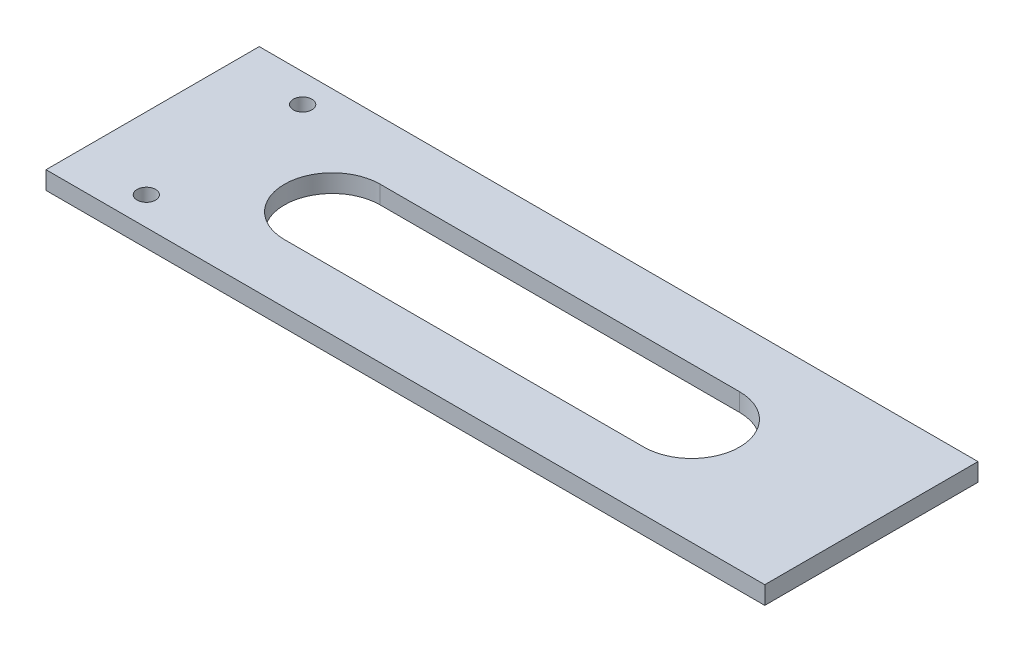
ISO-10303-21;
HEADER;
FILE_DESCRIPTION(('STEP AP214'),'2;1');
FILE_NAME('part.step','',(''),(''),'','','');
FILE_SCHEMA(('AUTOMOTIVE_DESIGN { 1 0 10303 214 1 1 1 1 }'));
ENDSEC;
DATA;
#1=APPLICATION_CONTEXT('core data for automotive mechanical design processes');
#2=APPLICATION_PROTOCOL_DEFINITION('international standard','automotive_design',2000,#1);
#3=PRODUCT_CONTEXT('',#1,'mechanical');
#4=PRODUCT('Part','Part','',(#3));
#5=PRODUCT_RELATED_PRODUCT_CATEGORY('part','',(#4));
#6=PRODUCT_DEFINITION_FORMATION('','',#4);
#7=PRODUCT_DEFINITION_CONTEXT('part definition',#1,'design');
#8=PRODUCT_DEFINITION('design','',#6,#7);
#9=PRODUCT_DEFINITION_SHAPE('','',#8);
#10=(LENGTH_UNIT() NAMED_UNIT(*) SI_UNIT(.MILLI.,.METRE.));
#11=(NAMED_UNIT(*) PLANE_ANGLE_UNIT() SI_UNIT($,.RADIAN.));
#12=(NAMED_UNIT(*) SI_UNIT($,.STERADIAN.) SOLID_ANGLE_UNIT());
#13=UNCERTAINTY_MEASURE_WITH_UNIT(LENGTH_MEASURE(1.E-05),#10,'distance_accuracy_value','');
#14=(GEOMETRIC_REPRESENTATION_CONTEXT(3) GLOBAL_UNCERTAINTY_ASSIGNED_CONTEXT((#13)) GLOBAL_UNIT_ASSIGNED_CONTEXT((#10,
#11,#12)) REPRESENTATION_CONTEXT('',''));
#15=CARTESIAN_POINT('',(0.,0.,0.));
#16=DIRECTION('',(0.,0.,1.));
#17=DIRECTION('',(1.,0.,0.));
#18=AXIS2_PLACEMENT_3D('',#15,#16,#17);
#19=CARTESIAN_POINT('',(0.,3.,0.));
#20=DIRECTION('',(0.,-1.,0.));
#21=DIRECTION('',(0.,0.,-1.));
#22=AXIS2_PLACEMENT_3D('',#19,#20,#21);
#23=PLANE('',#22);
#24=CARTESIAN_POINT('',(11.9999999999996,3.,-4.75000000000009));
#25=DIRECTION('',(0.,-1.,0.));
#26=DIRECTION('',(0.,0.,-1.));
#27=AXIS2_PLACEMENT_3D('',#24,#25,#26);
#28=CIRCLE('',#27,1.55);
#29=CARTESIAN_POINT('',(11.9999999999996,3.,-6.30000000000009));
#30=VERTEX_POINT('',#29);
#31=EDGE_CURVE('E234',#30,#30,#28,.T.);
#32=ORIENTED_EDGE('',*,*,#31,.T.);
#33=EDGE_LOOP('',(#32));
#34=FACE_BOUND('',#33,.T.);
#35=CARTESIAN_POINT('',(11.9999999999996,3.,-30.8500000000001));
#36=DIRECTION('',(0.,-1.,0.));
#37=DIRECTION('',(0.,0.,-1.));
#38=AXIS2_PLACEMENT_3D('',#35,#36,#37);
#39=CIRCLE('',#38,1.55);
#40=CARTESIAN_POINT('',(11.9999999999996,3.,-32.4000000000001));
#41=VERTEX_POINT('',#40);
#42=EDGE_CURVE('E128',#41,#41,#39,.T.);
#43=ORIENTED_EDGE('',*,*,#42,.T.);
#44=EDGE_LOOP('',(#43));
#45=FACE_BOUND('',#44,.T.);
#46=DIRECTION('',(0.,0.,1.));
#47=VECTOR('',#46,1.);
#48=CARTESIAN_POINT('',(0.,3.,0.));
#49=LINE('',#48,#47);
#50=CARTESIAN_POINT('',(0.,3.,-35.6));
#51=VERTEX_POINT('',#50);
#52=CARTESIAN_POINT('',(0.,3.,0.));
#53=VERTEX_POINT('',#52);
#54=EDGE_CURVE('E138',#51,#53,#49,.T.);
#55=ORIENTED_EDGE('',*,*,#54,.T.);
#56=DIRECTION('',(1.,0.,0.));
#57=VECTOR('',#56,1.);
#58=CARTESIAN_POINT('',(0.,3.,0.));
#59=LINE('',#58,#57);
#60=CARTESIAN_POINT('',(120.,3.,0.));
#61=VERTEX_POINT('',#60);
#62=EDGE_CURVE('E141',#53,#61,#59,.T.);
#63=ORIENTED_EDGE('',*,*,#62,.T.);
#64=DIRECTION('',(0.,0.,-1.));
#65=VECTOR('',#64,1.);
#66=CARTESIAN_POINT('',(120.,3.,0.));
#67=LINE('',#66,#65);
#68=CARTESIAN_POINT('',(120.,3.,-35.6));
#69=VERTEX_POINT('',#68);
#70=EDGE_CURVE('E144',#61,#69,#67,.T.);
#71=ORIENTED_EDGE('',*,*,#70,.T.);
#72=DIRECTION('',(-1.,0.,0.));
#73=VECTOR('',#72,1.);
#74=CARTESIAN_POINT('',(0.,3.,-35.6));
#75=LINE('',#74,#73);
#76=EDGE_CURVE('E146',#69,#51,#75,.T.);
#77=ORIENTED_EDGE('',*,*,#76,.T.);
#78=EDGE_LOOP('',(#55,#63,#71,#77));
#79=FACE_BOUND('',#78,.T.);
#80=CARTESIAN_POINT('',(30.,3.,-17.8));
#81=DIRECTION('',(0.,1.,0.));
#82=DIRECTION('',(0.,0.,1.));
#83=AXIS2_PLACEMENT_3D('',#80,#81,#82);
#84=CIRCLE('',#83,8.00000000000001);
#85=CARTESIAN_POINT('',(30.,3.,-25.8));
#86=VERTEX_POINT('',#85);
#87=CARTESIAN_POINT('',(30.,3.,-9.79999999999999));
#88=VERTEX_POINT('',#87);
#89=EDGE_CURVE('E100',#86,#88,#84,.T.);
#90=ORIENTED_EDGE('',*,*,#89,.F.);
#91=DIRECTION('',(-1.,0.,0.));
#92=VECTOR('',#91,1.);
#93=CARTESIAN_POINT('',(30.,3.,-25.8));
#94=LINE('',#93,#92);
#95=CARTESIAN_POINT('',(90.,3.,-25.8));
#96=VERTEX_POINT('',#95);
#97=EDGE_CURVE('E122',#96,#86,#94,.T.);
#98=ORIENTED_EDGE('',*,*,#97,.F.);
#99=CARTESIAN_POINT('',(90.,3.,-17.8));
#100=DIRECTION('',(0.,1.,0.));
#101=DIRECTION('',(0.,0.,1.));
#102=AXIS2_PLACEMENT_3D('',#99,#100,#101);
#103=CIRCLE('',#102,8.00000000000001);
#104=CARTESIAN_POINT('',(90.,3.,-9.8));
#105=VERTEX_POINT('',#104);
#106=EDGE_CURVE('E120',#105,#96,#103,.T.);
#107=ORIENTED_EDGE('',*,*,#106,.F.);
#108=DIRECTION('',(1.,0.,0.));
#109=VECTOR('',#108,1.);
#110=CARTESIAN_POINT('',(30.,3.,-9.79999999999999));
#111=LINE('',#110,#109);
#112=EDGE_CURVE('E108',#88,#105,#111,.T.);
#113=ORIENTED_EDGE('',*,*,#112,.F.);
#114=EDGE_LOOP('',(#90,#98,#107,#113));
#115=FACE_BOUND('',#114,.T.);
#116=ADVANCED_FACE('F35',(#34,#45,#79,#115),#23,.F.);
#117=CARTESIAN_POINT('',(0.,0.,0.));
#118=DIRECTION('',(0.,-1.,0.));
#119=DIRECTION('',(0.,0.,-1.));
#120=AXIS2_PLACEMENT_3D('',#117,#118,#119);
#121=PLANE('',#120);
#122=CARTESIAN_POINT('',(11.9999999999996,0.,-4.75000000000009));
#123=DIRECTION('',(0.,-1.,0.));
#124=DIRECTION('',(0.,0.,-1.));
#125=AXIS2_PLACEMENT_3D('',#122,#123,#124);
#126=CIRCLE('',#125,1.55);
#127=CARTESIAN_POINT('',(11.9999999999996,0.,-6.30000000000009));
#128=VERTEX_POINT('',#127);
#129=EDGE_CURVE('E237',#128,#128,#126,.T.);
#130=ORIENTED_EDGE('',*,*,#129,.F.);
#131=EDGE_LOOP('',(#130));
#132=FACE_BOUND('',#131,.T.);
#133=CARTESIAN_POINT('',(11.9999999999996,0.,-30.8500000000001));
#134=DIRECTION('',(0.,-1.,0.));
#135=DIRECTION('',(0.,0.,-1.));
#136=AXIS2_PLACEMENT_3D('',#133,#134,#135);
#137=CIRCLE('',#136,1.55);
#138=CARTESIAN_POINT('',(11.9999999999996,0.,-32.4000000000001));
#139=VERTEX_POINT('',#138);
#140=EDGE_CURVE('E232',#139,#139,#137,.T.);
#141=ORIENTED_EDGE('',*,*,#140,.F.);
#142=EDGE_LOOP('',(#141));
#143=FACE_BOUND('',#142,.T.);
#144=DIRECTION('',(0.,0.,1.));
#145=VECTOR('',#144,1.);
#146=CARTESIAN_POINT('',(0.,0.,0.));
#147=LINE('',#146,#145);
#148=CARTESIAN_POINT('',(0.,0.,-35.6));
#149=VERTEX_POINT('',#148);
#150=CARTESIAN_POINT('',(0.,0.,0.));
#151=VERTEX_POINT('',#150);
#152=EDGE_CURVE('E116',#149,#151,#147,.T.);
#153=ORIENTED_EDGE('',*,*,#152,.F.);
#154=DIRECTION('',(-1.,0.,0.));
#155=VECTOR('',#154,1.);
#156=CARTESIAN_POINT('',(0.,0.,-35.6));
#157=LINE('',#156,#155);
#158=CARTESIAN_POINT('',(120.,0.,-35.6));
#159=VERTEX_POINT('',#158);
#160=EDGE_CURVE('E142',#159,#149,#157,.T.);
#161=ORIENTED_EDGE('',*,*,#160,.F.);
#162=DIRECTION('',(0.,0.,-1.));
#163=VECTOR('',#162,1.);
#164=CARTESIAN_POINT('',(120.,0.,0.));
#165=LINE('',#164,#163);
#166=CARTESIAN_POINT('',(120.,0.,0.));
#167=VERTEX_POINT('',#166);
#168=EDGE_CURVE('E153',#167,#159,#165,.T.);
#169=ORIENTED_EDGE('',*,*,#168,.F.);
#170=DIRECTION('',(1.,0.,0.));
#171=VECTOR('',#170,1.);
#172=CARTESIAN_POINT('',(0.,0.,0.));
#173=LINE('',#172,#171);
#174=EDGE_CURVE('E151',#151,#167,#173,.T.);
#175=ORIENTED_EDGE('',*,*,#174,.F.);
#176=EDGE_LOOP('',(#153,#161,#169,#175));
#177=FACE_BOUND('',#176,.T.);
#178=DIRECTION('',(-1.,0.,0.));
#179=VECTOR('',#178,1.);
#180=CARTESIAN_POINT('',(30.,0.,-25.8));
#181=LINE('',#180,#179);
#182=CARTESIAN_POINT('',(90.,0.,-25.8));
#183=VERTEX_POINT('',#182);
#184=CARTESIAN_POINT('',(30.,0.,-25.8));
#185=VERTEX_POINT('',#184);
#186=EDGE_CURVE('E109',#183,#185,#181,.T.);
#187=ORIENTED_EDGE('',*,*,#186,.T.);
#188=CARTESIAN_POINT('',(30.,0.,-17.8));
#189=DIRECTION('',(0.,1.,0.));
#190=DIRECTION('',(0.,0.,1.));
#191=AXIS2_PLACEMENT_3D('',#188,#189,#190);
#192=CIRCLE('',#191,8.00000000000001);
#193=CARTESIAN_POINT('',(30.,0.,-9.79999999999999));
#194=VERTEX_POINT('',#193);
#195=EDGE_CURVE('E58',#185,#194,#192,.T.);
#196=ORIENTED_EDGE('',*,*,#195,.T.);
#197=DIRECTION('',(1.,0.,0.));
#198=VECTOR('',#197,1.);
#199=CARTESIAN_POINT('',(30.,0.,-9.79999999999999));
#200=LINE('',#199,#198);
#201=CARTESIAN_POINT('',(90.,0.,-9.8));
#202=VERTEX_POINT('',#201);
#203=EDGE_CURVE('E115',#194,#202,#200,.T.);
#204=ORIENTED_EDGE('',*,*,#203,.T.);
#205=CARTESIAN_POINT('',(90.,0.,-17.8));
#206=DIRECTION('',(0.,1.,0.));
#207=DIRECTION('',(0.,0.,1.));
#208=AXIS2_PLACEMENT_3D('',#205,#206,#207);
#209=CIRCLE('',#208,8.00000000000001);
#210=EDGE_CURVE('E130',#202,#183,#209,.T.);
#211=ORIENTED_EDGE('',*,*,#210,.T.);
#212=EDGE_LOOP('',(#187,#196,#204,#211));
#213=FACE_BOUND('',#212,.T.);
#214=ADVANCED_FACE('F171',(#132,#143,#177,#213),#121,.T.);
#215=CARTESIAN_POINT('',(0.,3.,0.));
#216=DIRECTION('',(1.,0.,0.));
#217=DIRECTION('',(0.,0.,-1.));
#218=AXIS2_PLACEMENT_3D('',#215,#216,#217);
#219=PLANE('',#218);
#220=ORIENTED_EDGE('',*,*,#152,.T.);
#221=DIRECTION('',(0.,-1.,0.));
#222=VECTOR('',#221,1.);
#223=CARTESIAN_POINT('',(0.,3.,0.));
#224=LINE('',#223,#222);
#225=EDGE_CURVE('E11',#53,#151,#224,.T.);
#226=ORIENTED_EDGE('',*,*,#225,.F.);
#227=ORIENTED_EDGE('',*,*,#54,.F.);
#228=DIRECTION('',(0.,-1.,0.));
#229=VECTOR('',#228,1.);
#230=CARTESIAN_POINT('',(0.,3.,-35.6));
#231=LINE('',#230,#229);
#232=EDGE_CURVE('E148',#51,#149,#231,.T.);
#233=ORIENTED_EDGE('',*,*,#232,.T.);
#234=EDGE_LOOP('',(#220,#226,#227,#233));
#235=FACE_BOUND('',#234,.T.);
#236=ADVANCED_FACE('F37',(#235),#219,.F.);
#237=CARTESIAN_POINT('',(0.,3.,0.));
#238=DIRECTION('',(0.,0.,-1.));
#239=DIRECTION('',(-1.,0.,0.));
#240=AXIS2_PLACEMENT_3D('',#237,#238,#239);
#241=PLANE('',#240);
#242=ORIENTED_EDGE('',*,*,#174,.T.);
#243=DIRECTION('',(0.,-1.,0.));
#244=VECTOR('',#243,1.);
#245=CARTESIAN_POINT('',(120.,3.,0.));
#246=LINE('',#245,#244);
#247=EDGE_CURVE('E43',#61,#167,#246,.T.);
#248=ORIENTED_EDGE('',*,*,#247,.F.);
#249=ORIENTED_EDGE('',*,*,#62,.F.);
#250=ORIENTED_EDGE('',*,*,#225,.T.);
#251=EDGE_LOOP('',(#242,#248,#249,#250));
#252=FACE_BOUND('',#251,.T.);
#253=ADVANCED_FACE('F181',(#252),#241,.F.);
#254=CARTESIAN_POINT('',(120.,3.,0.));
#255=DIRECTION('',(-1.,0.,0.));
#256=DIRECTION('',(0.,0.,1.));
#257=AXIS2_PLACEMENT_3D('',#254,#255,#256);
#258=PLANE('',#257);
#259=ORIENTED_EDGE('',*,*,#168,.T.);
#260=DIRECTION('',(0.,-1.,0.));
#261=VECTOR('',#260,1.);
#262=CARTESIAN_POINT('',(120.,3.,-35.6));
#263=LINE('',#262,#261);
#264=EDGE_CURVE('E158',#69,#159,#263,.T.);
#265=ORIENTED_EDGE('',*,*,#264,.F.);
#266=ORIENTED_EDGE('',*,*,#70,.F.);
#267=ORIENTED_EDGE('',*,*,#247,.T.);
#268=EDGE_LOOP('',(#259,#265,#266,#267));
#269=FACE_BOUND('',#268,.T.);
#270=ADVANCED_FACE('F165',(#269),#258,.F.);
#271=CARTESIAN_POINT('',(0.,3.,-35.6));
#272=DIRECTION('',(0.,0.,1.));
#273=DIRECTION('',(1.,0.,0.));
#274=AXIS2_PLACEMENT_3D('',#271,#272,#273);
#275=PLANE('',#274);
#276=ORIENTED_EDGE('',*,*,#160,.T.);
#277=ORIENTED_EDGE('',*,*,#232,.F.);
#278=ORIENTED_EDGE('',*,*,#76,.F.);
#279=ORIENTED_EDGE('',*,*,#264,.T.);
#280=EDGE_LOOP('',(#276,#277,#278,#279));
#281=FACE_BOUND('',#280,.T.);
#282=ADVANCED_FACE('F175',(#281),#275,.F.);
#283=CARTESIAN_POINT('',(30.,3.,-17.8));
#284=DIRECTION('',(0.,-1.,0.));
#285=DIRECTION('',(0.,0.,-1.));
#286=AXIS2_PLACEMENT_3D('',#283,#284,#285);
#287=CYLINDRICAL_SURFACE('',#286,8.00000000000001);
#288=ORIENTED_EDGE('',*,*,#195,.F.);
#289=DIRECTION('',(0.,-1.,0.));
#290=VECTOR('',#289,1.);
#291=CARTESIAN_POINT('',(30.,3.,-25.8));
#292=LINE('',#291,#290);
#293=EDGE_CURVE('E104',#86,#185,#292,.T.);
#294=ORIENTED_EDGE('',*,*,#293,.F.);
#295=ORIENTED_EDGE('',*,*,#89,.T.);
#296=DIRECTION('',(0.,-1.,0.));
#297=VECTOR('',#296,1.);
#298=CARTESIAN_POINT('',(30.,3.,-9.79999999999999));
#299=LINE('',#298,#297);
#300=EDGE_CURVE('E103',#88,#194,#299,.T.);
#301=ORIENTED_EDGE('',*,*,#300,.T.);
#302=EDGE_LOOP('',(#288,#294,#295,#301));
#303=FACE_BOUND('',#302,.T.);
#304=ADVANCED_FACE('F102',(#303),#287,.F.);
#305=CARTESIAN_POINT('',(30.,3.,-9.79999999999999));
#306=DIRECTION('',(0.,0.,-1.));
#307=DIRECTION('',(-1.,0.,0.));
#308=AXIS2_PLACEMENT_3D('',#305,#306,#307);
#309=PLANE('',#308);
#310=ORIENTED_EDGE('',*,*,#203,.F.);
#311=ORIENTED_EDGE('',*,*,#300,.F.);
#312=ORIENTED_EDGE('',*,*,#112,.T.);
#313=DIRECTION('',(0.,-1.,0.));
#314=VECTOR('',#313,1.);
#315=CARTESIAN_POINT('',(90.,3.,-9.8));
#316=LINE('',#315,#314);
#317=EDGE_CURVE('E117',#105,#202,#316,.T.);
#318=ORIENTED_EDGE('',*,*,#317,.T.);
#319=EDGE_LOOP('',(#310,#311,#312,#318));
#320=FACE_BOUND('',#319,.T.);
#321=ADVANCED_FACE('F112',(#320),#309,.T.);
#322=CARTESIAN_POINT('',(90.,3.,-17.8));
#323=DIRECTION('',(0.,-1.,0.));
#324=DIRECTION('',(0.,0.,-1.));
#325=AXIS2_PLACEMENT_3D('',#322,#323,#324);
#326=CYLINDRICAL_SURFACE('',#325,8.00000000000001);
#327=ORIENTED_EDGE('',*,*,#210,.F.);
#328=ORIENTED_EDGE('',*,*,#317,.F.);
#329=ORIENTED_EDGE('',*,*,#106,.T.);
#330=DIRECTION('',(0.,-1.,0.));
#331=VECTOR('',#330,1.);
#332=CARTESIAN_POINT('',(90.,3.,-25.8));
#333=LINE('',#332,#331);
#334=EDGE_CURVE('E50',#96,#183,#333,.T.);
#335=ORIENTED_EDGE('',*,*,#334,.T.);
#336=EDGE_LOOP('',(#327,#328,#329,#335));
#337=FACE_BOUND('',#336,.T.);
#338=ADVANCED_FACE('F208',(#337),#326,.F.);
#339=CARTESIAN_POINT('',(30.,3.,-25.8));
#340=DIRECTION('',(0.,0.,1.));
#341=DIRECTION('',(1.,0.,0.));
#342=AXIS2_PLACEMENT_3D('',#339,#340,#341);
#343=PLANE('',#342);
#344=ORIENTED_EDGE('',*,*,#186,.F.);
#345=ORIENTED_EDGE('',*,*,#334,.F.);
#346=ORIENTED_EDGE('',*,*,#97,.T.);
#347=ORIENTED_EDGE('',*,*,#293,.T.);
#348=EDGE_LOOP('',(#344,#345,#346,#347));
#349=FACE_BOUND('',#348,.T.);
#350=ADVANCED_FACE('F212',(#349),#343,.T.);
#351=CARTESIAN_POINT('',(11.9999999999996,3.,-30.8500000000001));
#352=DIRECTION('',(0.,-1.,0.));
#353=DIRECTION('',(0.,0.,-1.));
#354=AXIS2_PLACEMENT_3D('',#351,#352,#353);
#355=CYLINDRICAL_SURFACE('',#354,1.55);
#356=ORIENTED_EDGE('',*,*,#42,.F.);
#357=EDGE_LOOP('',(#356));
#358=FACE_BOUND('',#357,.T.);
#359=ORIENTED_EDGE('',*,*,#140,.T.);
#360=EDGE_LOOP('',(#359));
#361=FACE_BOUND('',#360,.T.);
#362=ADVANCED_FACE('F218',(#358,#361),#355,.F.);
#363=CARTESIAN_POINT('',(11.9999999999996,3.,-4.75000000000009));
#364=DIRECTION('',(0.,-1.,0.));
#365=DIRECTION('',(0.,0.,-1.));
#366=AXIS2_PLACEMENT_3D('',#363,#364,#365);
#367=CYLINDRICAL_SURFACE('',#366,1.55);
#368=ORIENTED_EDGE('',*,*,#31,.F.);
#369=EDGE_LOOP('',(#368));
#370=FACE_BOUND('',#369,.T.);
#371=ORIENTED_EDGE('',*,*,#129,.T.);
#372=EDGE_LOOP('',(#371));
#373=FACE_BOUND('',#372,.T.);
#374=ADVANCED_FACE('F219',(#370,#373),#367,.F.);
#375=CLOSED_SHELL('',(#116,#214,#236,#253,#270,#282,#304,#321,#338,#350,#362,#374));
#376=MANIFOLD_SOLID_BREP('B2',#375);
#377=ADVANCED_BREP_SHAPE_REPRESENTATION('',(#18,#376),#14);
#378=SHAPE_DEFINITION_REPRESENTATION(#9,#377);
ENDSEC;
END-ISO-10303-21;
